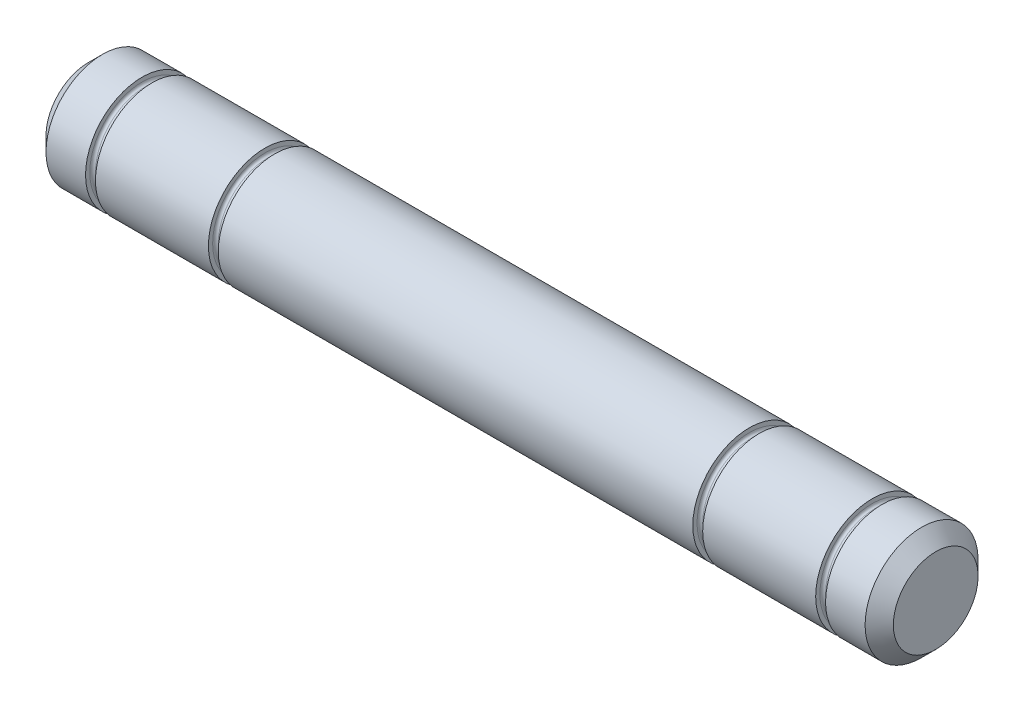
ISO-10303-21;
HEADER;
FILE_DESCRIPTION(('STEP AP214'),'2;1');
FILE_NAME('part.step','',(''),(''),'','','');
FILE_SCHEMA(('AUTOMOTIVE_DESIGN { 1 0 10303 214 1 1 1 1 }'));
ENDSEC;
DATA;
#1=APPLICATION_CONTEXT('core data for automotive mechanical design processes');
#2=APPLICATION_PROTOCOL_DEFINITION('international standard','automotive_design',2000,#1);
#3=PRODUCT_CONTEXT('',#1,'mechanical');
#4=PRODUCT('Part','Part','',(#3));
#5=PRODUCT_RELATED_PRODUCT_CATEGORY('part','',(#4));
#6=PRODUCT_DEFINITION_FORMATION('','',#4);
#7=PRODUCT_DEFINITION_CONTEXT('part definition',#1,'design');
#8=PRODUCT_DEFINITION('design','',#6,#7);
#9=PRODUCT_DEFINITION_SHAPE('','',#8);
#10=(LENGTH_UNIT() NAMED_UNIT(*) SI_UNIT(.MILLI.,.METRE.));
#11=(NAMED_UNIT(*) PLANE_ANGLE_UNIT() SI_UNIT($,.RADIAN.));
#12=(NAMED_UNIT(*) SI_UNIT($,.STERADIAN.) SOLID_ANGLE_UNIT());
#13=UNCERTAINTY_MEASURE_WITH_UNIT(LENGTH_MEASURE(1.E-05),#10,'distance_accuracy_value','');
#14=(GEOMETRIC_REPRESENTATION_CONTEXT(3) GLOBAL_UNCERTAINTY_ASSIGNED_CONTEXT((#13)) GLOBAL_UNIT_ASSIGNED_CONTEXT((#10,
#11,#12)) REPRESENTATION_CONTEXT('',''));
#15=CARTESIAN_POINT('',(0.,0.,0.));
#16=DIRECTION('',(0.,0.,1.));
#17=DIRECTION('',(1.,0.,0.));
#18=AXIS2_PLACEMENT_3D('',#15,#16,#17);
#19=CARTESIAN_POINT('',(-30.,0.,0.));
#20=DIRECTION('',(-1.,0.,0.));
#21=DIRECTION('',(0.,0.,1.));
#22=AXIS2_PLACEMENT_3D('',#19,#20,#21);
#23=CYLINDRICAL_SURFACE('',#22,4.);
#24=CARTESIAN_POINT('',(26.2,0.,0.));
#25=DIRECTION('',(1.,0.,0.));
#26=DIRECTION('',(0.,0.,-1.));
#27=AXIS2_PLACEMENT_3D('',#24,#25,#26);
#28=CIRCLE('',#27,4.);
#29=CARTESIAN_POINT('',(26.2,0.,-4.));
#30=VERTEX_POINT('',#29);
#31=EDGE_CURVE('E63',#30,#30,#28,.T.);
#32=ORIENTED_EDGE('',*,*,#31,.T.);
#33=EDGE_LOOP('',(#32));
#34=FACE_BOUND('',#33,.T.);
#35=CARTESIAN_POINT('',(29.,0.,0.));
#36=DIRECTION('',(-1.,0.,0.));
#37=DIRECTION('',(0.,0.,1.));
#38=AXIS2_PLACEMENT_3D('',#35,#36,#37);
#39=CIRCLE('',#38,4.);
#40=CARTESIAN_POINT('',(29.,0.,4.));
#41=VERTEX_POINT('',#40);
#42=EDGE_CURVE('E49',#41,#41,#39,.T.);
#43=ORIENTED_EDGE('',*,*,#42,.T.);
#44=EDGE_LOOP('',(#43));
#45=FACE_BOUND('',#44,.T.);
#46=ADVANCED_FACE('F35',(#34,#45),#23,.T.);
#47=CARTESIAN_POINT('',(30.,4.,0.));
#48=DIRECTION('',(-1.,0.,0.));
#49=DIRECTION('',(0.,0.,1.));
#50=AXIS2_PLACEMENT_3D('',#47,#48,#49);
#51=PLANE('',#50);
#52=CARTESIAN_POINT('',(30.,0.,0.));
#53=DIRECTION('',(-1.,0.,0.));
#54=DIRECTION('',(0.,0.,1.));
#55=AXIS2_PLACEMENT_3D('',#52,#53,#54);
#56=CIRCLE('',#55,3.);
#57=CARTESIAN_POINT('',(30.,0.,3.));
#58=VERTEX_POINT('',#57);
#59=EDGE_CURVE('E44',#58,#58,#56,.F.);
#60=ORIENTED_EDGE('',*,*,#59,.T.);
#61=EDGE_LOOP('',(#60));
#62=FACE_BOUND('',#61,.T.);
#63=ADVANCED_FACE('F106',(#62),#51,.F.);
#64=CARTESIAN_POINT('',(29.,0.,0.));
#65=DIRECTION('',(-1.,0.,0.));
#66=DIRECTION('',(0.,0.,1.));
#67=AXIS2_PLACEMENT_3D('',#64,#65,#66);
#68=CONICAL_SURFACE('',#67,4.,0.78539816339745);
#69=ORIENTED_EDGE('',*,*,#59,.F.);
#70=EDGE_LOOP('',(#69));
#71=FACE_BOUND('',#70,.T.);
#72=ORIENTED_EDGE('',*,*,#42,.F.);
#73=EDGE_LOOP('',(#72));
#74=FACE_BOUND('',#73,.T.);
#75=ADVANCED_FACE('F103',(#71,#74),#68,.T.);
#76=CARTESIAN_POINT('',(26.2,0.,3.7));
#77=DIRECTION('',(1.,0.,0.));
#78=DIRECTION('',(0.,0.,-1.));
#79=AXIS2_PLACEMENT_3D('',#76,#77,#78);
#80=PLANE('',#79);
#81=CARTESIAN_POINT('',(26.2,0.,0.));
#82=DIRECTION('',(-1.,0.,0.));
#83=DIRECTION('',(0.,0.,1.));
#84=AXIS2_PLACEMENT_3D('',#81,#82,#83);
#85=CIRCLE('',#84,3.7);
#86=CARTESIAN_POINT('',(26.2,0.,3.7));
#87=VERTEX_POINT('',#86);
#88=EDGE_CURVE('E57',#87,#87,#85,.T.);
#89=ORIENTED_EDGE('',*,*,#88,.F.);
#90=EDGE_LOOP('',(#89));
#91=FACE_BOUND('',#90,.T.);
#92=ORIENTED_EDGE('',*,*,#31,.F.);
#93=EDGE_LOOP('',(#92));
#94=FACE_BOUND('',#93,.T.);
#95=ADVANCED_FACE('F105',(#91,#94),#80,.F.);
#96=CARTESIAN_POINT('',(25.5,0.,3.7));
#97=DIRECTION('',(-1.,0.,0.));
#98=DIRECTION('',(0.,0.,1.));
#99=AXIS2_PLACEMENT_3D('',#96,#97,#98);
#100=PLANE('',#99);
#101=CARTESIAN_POINT('',(25.5,0.,0.));
#102=DIRECTION('',(-1.,0.,0.));
#103=DIRECTION('',(0.,0.,1.));
#104=AXIS2_PLACEMENT_3D('',#101,#102,#103);
#105=CIRCLE('',#104,3.7);
#106=CARTESIAN_POINT('',(25.5,0.,3.7));
#107=VERTEX_POINT('',#106);
#108=EDGE_CURVE('E97',#107,#107,#105,.T.);
#109=ORIENTED_EDGE('',*,*,#108,.T.);
#110=EDGE_LOOP('',(#109));
#111=FACE_BOUND('',#110,.T.);
#112=CARTESIAN_POINT('',(25.5,0.,0.));
#113=DIRECTION('',(-1.,0.,0.));
#114=DIRECTION('',(0.,0.,1.));
#115=AXIS2_PLACEMENT_3D('',#112,#113,#114);
#116=CIRCLE('',#115,4.);
#117=CARTESIAN_POINT('',(25.5,0.,4.));
#118=VERTEX_POINT('',#117);
#119=EDGE_CURVE('E60',#118,#118,#116,.T.);
#120=ORIENTED_EDGE('',*,*,#119,.F.);
#121=EDGE_LOOP('',(#120));
#122=FACE_BOUND('',#121,.T.);
#123=ADVANCED_FACE('F112',(#111,#122),#100,.F.);
#124=CARTESIAN_POINT('',(26.,0.,0.));
#125=DIRECTION('',(-1.,0.,0.));
#126=DIRECTION('',(0.,0.,1.));
#127=AXIS2_PLACEMENT_3D('',#124,#125,#126);
#128=TOROIDAL_SURFACE('',#127,3.7,0.199999999999999);
#129=CARTESIAN_POINT('',(26.,0.,0.));
#130=DIRECTION('',(-1.,0.,0.));
#131=DIRECTION('',(0.,0.,1.));
#132=AXIS2_PLACEMENT_3D('',#129,#130,#131);
#133=CIRCLE('',#132,3.5);
#134=CARTESIAN_POINT('',(26.,0.,3.5));
#135=VERTEX_POINT('',#134);
#136=EDGE_CURVE('E396',#135,#135,#133,.T.);
#137=ORIENTED_EDGE('',*,*,#136,.F.);
#138=EDGE_LOOP('',(#137));
#139=FACE_BOUND('',#138,.T.);
#140=ORIENTED_EDGE('',*,*,#88,.T.);
#141=EDGE_LOOP('',(#140));
#142=FACE_BOUND('',#141,.T.);
#143=ADVANCED_FACE('F337',(#139,#142),#128,.F.);
#144=CARTESIAN_POINT('',(0.,0.,0.));
#145=DIRECTION('',(-1.,0.,0.));
#146=DIRECTION('',(0.,0.,1.));
#147=AXIS2_PLACEMENT_3D('',#144,#145,#146);
#148=CYLINDRICAL_SURFACE('',#147,3.5);
#149=CARTESIAN_POINT('',(25.7,0.,0.));
#150=DIRECTION('',(-1.,0.,0.));
#151=DIRECTION('',(0.,0.,1.));
#152=AXIS2_PLACEMENT_3D('',#149,#150,#151);
#153=CIRCLE('',#152,3.5);
#154=CARTESIAN_POINT('',(25.7,0.,3.5));
#155=VERTEX_POINT('',#154);
#156=EDGE_CURVE('E395',#155,#155,#153,.T.);
#157=ORIENTED_EDGE('',*,*,#156,.F.);
#158=EDGE_LOOP('',(#157));
#159=FACE_BOUND('',#158,.T.);
#160=ORIENTED_EDGE('',*,*,#136,.T.);
#161=EDGE_LOOP('',(#160));
#162=FACE_BOUND('',#161,.T.);
#163=ADVANCED_FACE('F347',(#159,#162),#148,.T.);
#164=CARTESIAN_POINT('',(25.7,0.,0.));
#165=DIRECTION('',(-1.,0.,0.));
#166=DIRECTION('',(0.,0.,1.));
#167=AXIS2_PLACEMENT_3D('',#164,#165,#166);
#168=TOROIDAL_SURFACE('',#167,3.7,0.199999999999999);
#169=ORIENTED_EDGE('',*,*,#108,.F.);
#170=EDGE_LOOP('',(#169));
#171=FACE_BOUND('',#170,.T.);
#172=ORIENTED_EDGE('',*,*,#156,.T.);
#173=EDGE_LOOP('',(#172));
#174=FACE_BOUND('',#173,.T.);
#175=ADVANCED_FACE('F131',(#171,#174),#168,.F.);
#176=ORIENTED_EDGE('',*,*,#119,.T.);
#177=EDGE_LOOP('',(#176));
#178=FACE_BOUND('',#177,.T.);
#179=CARTESIAN_POINT('',(17.5,0.,0.));
#180=DIRECTION('',(1.,0.,0.));
#181=DIRECTION('',(0.,0.,-1.));
#182=AXIS2_PLACEMENT_3D('',#179,#180,#181);
#183=CIRCLE('',#182,4.);
#184=CARTESIAN_POINT('',(17.5,0.,-4.));
#185=VERTEX_POINT('',#184);
#186=EDGE_CURVE('E56',#185,#185,#183,.T.);
#187=ORIENTED_EDGE('',*,*,#186,.T.);
#188=EDGE_LOOP('',(#187));
#189=FACE_BOUND('',#188,.T.);
#190=ADVANCED_FACE('F123',(#178,#189),#23,.T.);
#191=CARTESIAN_POINT('',(17.5,0.,3.7));
#192=DIRECTION('',(1.,0.,0.));
#193=DIRECTION('',(0.,0.,-1.));
#194=AXIS2_PLACEMENT_3D('',#191,#192,#193);
#195=PLANE('',#194);
#196=CARTESIAN_POINT('',(17.5,0.,0.));
#197=DIRECTION('',(-1.,0.,0.));
#198=DIRECTION('',(0.,0.,1.));
#199=AXIS2_PLACEMENT_3D('',#196,#197,#198);
#200=CIRCLE('',#199,3.7);
#201=CARTESIAN_POINT('',(17.5,0.,3.7));
#202=VERTEX_POINT('',#201);
#203=EDGE_CURVE('E94',#202,#202,#200,.T.);
#204=ORIENTED_EDGE('',*,*,#203,.F.);
#205=EDGE_LOOP('',(#204));
#206=FACE_BOUND('',#205,.T.);
#207=ORIENTED_EDGE('',*,*,#186,.F.);
#208=EDGE_LOOP('',(#207));
#209=FACE_BOUND('',#208,.T.);
#210=ADVANCED_FACE('F130',(#206,#209),#195,.F.);
#211=CARTESIAN_POINT('',(16.8,0.,3.7));
#212=DIRECTION('',(-1.,0.,0.));
#213=DIRECTION('',(0.,0.,1.));
#214=AXIS2_PLACEMENT_3D('',#211,#212,#213);
#215=PLANE('',#214);
#216=CARTESIAN_POINT('',(16.8,0.,0.));
#217=DIRECTION('',(-1.,0.,0.));
#218=DIRECTION('',(0.,0.,1.));
#219=AXIS2_PLACEMENT_3D('',#216,#217,#218);
#220=CIRCLE('',#219,3.7);
#221=CARTESIAN_POINT('',(16.8,0.,3.7));
#222=VERTEX_POINT('',#221);
#223=EDGE_CURVE('E78',#222,#222,#220,.T.);
#224=ORIENTED_EDGE('',*,*,#223,.T.);
#225=EDGE_LOOP('',(#224));
#226=FACE_BOUND('',#225,.T.);
#227=CARTESIAN_POINT('',(16.8,0.,0.));
#228=DIRECTION('',(-1.,0.,0.));
#229=DIRECTION('',(0.,0.,1.));
#230=AXIS2_PLACEMENT_3D('',#227,#228,#229);
#231=CIRCLE('',#230,4.);
#232=CARTESIAN_POINT('',(16.8,0.,4.));
#233=VERTEX_POINT('',#232);
#234=EDGE_CURVE('E53',#233,#233,#231,.T.);
#235=ORIENTED_EDGE('',*,*,#234,.F.);
#236=EDGE_LOOP('',(#235));
#237=FACE_BOUND('',#236,.T.);
#238=ADVANCED_FACE('F173',(#226,#237),#215,.F.);
#239=CARTESIAN_POINT('',(17.3,0.,0.));
#240=DIRECTION('',(-1.,0.,0.));
#241=DIRECTION('',(0.,0.,1.));
#242=AXIS2_PLACEMENT_3D('',#239,#240,#241);
#243=TOROIDAL_SURFACE('',#242,3.7,0.200000000000001);
#244=CARTESIAN_POINT('',(17.3,0.,0.));
#245=DIRECTION('',(-1.,0.,0.));
#246=DIRECTION('',(0.,0.,1.));
#247=AXIS2_PLACEMENT_3D('',#244,#245,#246);
#248=CIRCLE('',#247,3.5);
#249=CARTESIAN_POINT('',(17.3,0.,3.5));
#250=VERTEX_POINT('',#249);
#251=EDGE_CURVE('E87',#250,#250,#248,.T.);
#252=ORIENTED_EDGE('',*,*,#251,.F.);
#253=EDGE_LOOP('',(#252));
#254=FACE_BOUND('',#253,.T.);
#255=ORIENTED_EDGE('',*,*,#203,.T.);
#256=EDGE_LOOP('',(#255));
#257=FACE_BOUND('',#256,.T.);
#258=ADVANCED_FACE('F175',(#254,#257),#243,.F.);
#259=CARTESIAN_POINT('',(0.,0.,0.));
#260=DIRECTION('',(-1.,0.,0.));
#261=DIRECTION('',(0.,0.,1.));
#262=AXIS2_PLACEMENT_3D('',#259,#260,#261);
#263=CYLINDRICAL_SURFACE('',#262,3.5);
#264=CARTESIAN_POINT('',(17.,0.,0.));
#265=DIRECTION('',(-1.,0.,0.));
#266=DIRECTION('',(0.,0.,1.));
#267=AXIS2_PLACEMENT_3D('',#264,#265,#266);
#268=CIRCLE('',#267,3.5);
#269=CARTESIAN_POINT('',(17.,0.,3.5));
#270=VERTEX_POINT('',#269);
#271=EDGE_CURVE('E82',#270,#270,#268,.T.);
#272=ORIENTED_EDGE('',*,*,#271,.F.);
#273=EDGE_LOOP('',(#272));
#274=FACE_BOUND('',#273,.T.);
#275=ORIENTED_EDGE('',*,*,#251,.T.);
#276=EDGE_LOOP('',(#275));
#277=FACE_BOUND('',#276,.T.);
#278=ADVANCED_FACE('F166',(#274,#277),#263,.T.);
#279=CARTESIAN_POINT('',(17.,0.,0.));
#280=DIRECTION('',(-1.,0.,0.));
#281=DIRECTION('',(0.,0.,1.));
#282=AXIS2_PLACEMENT_3D('',#279,#280,#281);
#283=TOROIDAL_SURFACE('',#282,3.7,0.199999999999999);
#284=ORIENTED_EDGE('',*,*,#223,.F.);
#285=EDGE_LOOP('',(#284));
#286=FACE_BOUND('',#285,.T.);
#287=ORIENTED_EDGE('',*,*,#271,.T.);
#288=EDGE_LOOP('',(#287));
#289=FACE_BOUND('',#288,.T.);
#290=ADVANCED_FACE('F157',(#286,#289),#283,.F.);
#291=CARTESIAN_POINT('',(-16.8,0.,0.));
#292=DIRECTION('',(1.,0.,0.));
#293=DIRECTION('',(0.,0.,-1.));
#294=AXIS2_PLACEMENT_3D('',#291,#292,#293);
#295=CIRCLE('',#294,4.);
#296=CARTESIAN_POINT('',(-16.8,0.,-4.));
#297=VERTEX_POINT('',#296);
#298=EDGE_CURVE('E67',#297,#297,#295,.T.);
#299=ORIENTED_EDGE('',*,*,#298,.T.);
#300=EDGE_LOOP('',(#299));
#301=FACE_BOUND('',#300,.T.);
#302=ORIENTED_EDGE('',*,*,#234,.T.);
#303=EDGE_LOOP('',(#302));
#304=FACE_BOUND('',#303,.T.);
#305=ADVANCED_FACE('F127',(#301,#304),#23,.T.);
#306=CARTESIAN_POINT('',(-17.5,0.,3.7));
#307=DIRECTION('',(-1.,0.,0.));
#308=DIRECTION('',(0.,0.,-1.));
#309=AXIS2_PLACEMENT_3D('',#306,#307,#308);
#310=PLANE('',#309);
#311=CARTESIAN_POINT('',(-17.5,0.,0.));
#312=DIRECTION('',(-1.,0.,0.));
#313=DIRECTION('',(0.,0.,1.));
#314=AXIS2_PLACEMENT_3D('',#311,#312,#313);
#315=CIRCLE('',#314,3.7);
#316=CARTESIAN_POINT('',(-17.5,0.,3.7));
#317=VERTEX_POINT('',#316);
#318=EDGE_CURVE('E401',#317,#317,#315,.T.);
#319=ORIENTED_EDGE('',*,*,#318,.T.);
#320=EDGE_LOOP('',(#319));
#321=FACE_BOUND('',#320,.T.);
#322=CARTESIAN_POINT('',(-17.5,0.,0.));
#323=DIRECTION('',(-1.,0.,0.));
#324=DIRECTION('',(0.,0.,1.));
#325=AXIS2_PLACEMENT_3D('',#322,#323,#324);
#326=CIRCLE('',#325,4.);
#327=CARTESIAN_POINT('',(-17.5,0.,4.));
#328=VERTEX_POINT('',#327);
#329=EDGE_CURVE('E70',#328,#328,#326,.T.);
#330=ORIENTED_EDGE('',*,*,#329,.F.);
#331=EDGE_LOOP('',(#330));
#332=FACE_BOUND('',#331,.T.);
#333=ADVANCED_FACE('F156',(#321,#332),#310,.F.);
#334=CARTESIAN_POINT('',(-16.8,0.,3.7));
#335=DIRECTION('',(1.,0.,0.));
#336=DIRECTION('',(0.,0.,1.));
#337=AXIS2_PLACEMENT_3D('',#334,#335,#336);
#338=PLANE('',#337);
#339=CARTESIAN_POINT('',(-16.8,0.,0.));
#340=DIRECTION('',(-1.,0.,0.));
#341=DIRECTION('',(0.,0.,1.));
#342=AXIS2_PLACEMENT_3D('',#339,#340,#341);
#343=CIRCLE('',#342,3.7);
#344=CARTESIAN_POINT('',(-16.8,0.,3.7));
#345=VERTEX_POINT('',#344);
#346=EDGE_CURVE('E411',#345,#345,#343,.T.);
#347=ORIENTED_EDGE('',*,*,#346,.F.);
#348=EDGE_LOOP('',(#347));
#349=FACE_BOUND('',#348,.T.);
#350=ORIENTED_EDGE('',*,*,#298,.F.);
#351=EDGE_LOOP('',(#350));
#352=FACE_BOUND('',#351,.T.);
#353=ADVANCED_FACE('F163',(#349,#352),#338,.F.);
#354=CARTESIAN_POINT('',(-17.3,0.,0.));
#355=DIRECTION('',(1.,0.,0.));
#356=DIRECTION('',(0.,0.,1.));
#357=AXIS2_PLACEMENT_3D('',#354,#355,#356);
#358=TOROIDAL_SURFACE('',#357,3.7,0.200000000000001);
#359=CARTESIAN_POINT('',(-17.3,0.,0.));
#360=DIRECTION('',(-1.,0.,0.));
#361=DIRECTION('',(0.,0.,1.));
#362=AXIS2_PLACEMENT_3D('',#359,#360,#361);
#363=CIRCLE('',#362,3.5);
#364=CARTESIAN_POINT('',(-17.3,0.,3.5));
#365=VERTEX_POINT('',#364);
#366=EDGE_CURVE('E405',#365,#365,#363,.T.);
#367=ORIENTED_EDGE('',*,*,#366,.T.);
#368=EDGE_LOOP('',(#367));
#369=FACE_BOUND('',#368,.T.);
#370=ORIENTED_EDGE('',*,*,#318,.F.);
#371=EDGE_LOOP('',(#370));
#372=FACE_BOUND('',#371,.T.);
#373=ADVANCED_FACE('F228',(#369,#372),#358,.F.);
#374=CARTESIAN_POINT('',(0.,0.,0.));
#375=DIRECTION('',(1.,0.,0.));
#376=DIRECTION('',(0.,0.,1.));
#377=AXIS2_PLACEMENT_3D('',#374,#375,#376);
#378=CYLINDRICAL_SURFACE('',#377,3.5);
#379=CARTESIAN_POINT('',(-17.,0.,0.));
#380=DIRECTION('',(-1.,0.,0.));
#381=DIRECTION('',(0.,0.,1.));
#382=AXIS2_PLACEMENT_3D('',#379,#380,#381);
#383=CIRCLE('',#382,3.5);
#384=CARTESIAN_POINT('',(-17.,0.,3.5));
#385=VERTEX_POINT('',#384);
#386=EDGE_CURVE('E408',#385,#385,#383,.T.);
#387=ORIENTED_EDGE('',*,*,#386,.T.);
#388=EDGE_LOOP('',(#387));
#389=FACE_BOUND('',#388,.T.);
#390=ORIENTED_EDGE('',*,*,#366,.F.);
#391=EDGE_LOOP('',(#390));
#392=FACE_BOUND('',#391,.T.);
#393=ADVANCED_FACE('F144',(#389,#392),#378,.T.);
#394=CARTESIAN_POINT('',(-17.,0.,0.));
#395=DIRECTION('',(1.,0.,0.));
#396=DIRECTION('',(0.,0.,1.));
#397=AXIS2_PLACEMENT_3D('',#394,#395,#396);
#398=TOROIDAL_SURFACE('',#397,3.7,0.199999999999999);
#399=ORIENTED_EDGE('',*,*,#346,.T.);
#400=EDGE_LOOP('',(#399));
#401=FACE_BOUND('',#400,.T.);
#402=ORIENTED_EDGE('',*,*,#386,.F.);
#403=EDGE_LOOP('',(#402));
#404=FACE_BOUND('',#403,.T.);
#405=ADVANCED_FACE('F135',(#401,#404),#398,.F.);
#406=CARTESIAN_POINT('',(-25.5,0.,0.));
#407=DIRECTION('',(1.,0.,0.));
#408=DIRECTION('',(0.,0.,-1.));
#409=AXIS2_PLACEMENT_3D('',#406,#407,#408);
#410=CIRCLE('',#409,4.);
#411=CARTESIAN_POINT('',(-25.5,0.,-4.));
#412=VERTEX_POINT('',#411);
#413=EDGE_CURVE('E73',#412,#412,#410,.T.);
#414=ORIENTED_EDGE('',*,*,#413,.T.);
#415=EDGE_LOOP('',(#414));
#416=FACE_BOUND('',#415,.T.);
#417=ORIENTED_EDGE('',*,*,#329,.T.);
#418=EDGE_LOOP('',(#417));
#419=FACE_BOUND('',#418,.T.);
#420=ADVANCED_FACE('F124',(#416,#419),#23,.T.);
#421=CARTESIAN_POINT('',(-26.2,0.,3.7));
#422=DIRECTION('',(-1.,0.,0.));
#423=DIRECTION('',(0.,0.,-1.));
#424=AXIS2_PLACEMENT_3D('',#421,#422,#423);
#425=PLANE('',#424);
#426=CARTESIAN_POINT('',(-26.2,0.,0.));
#427=DIRECTION('',(-1.,0.,0.));
#428=DIRECTION('',(0.,0.,1.));
#429=AXIS2_PLACEMENT_3D('',#426,#427,#428);
#430=CIRCLE('',#429,3.7);
#431=CARTESIAN_POINT('',(-26.2,0.,3.7));
#432=VERTEX_POINT('',#431);
#433=EDGE_CURVE('E71',#432,#432,#430,.T.);
#434=ORIENTED_EDGE('',*,*,#433,.T.);
#435=EDGE_LOOP('',(#434));
#436=FACE_BOUND('',#435,.T.);
#437=CARTESIAN_POINT('',(-26.2,0.,0.));
#438=DIRECTION('',(-1.,0.,0.));
#439=DIRECTION('',(0.,0.,1.));
#440=AXIS2_PLACEMENT_3D('',#437,#438,#439);
#441=CIRCLE('',#440,4.);
#442=CARTESIAN_POINT('',(-26.2,0.,4.));
#443=VERTEX_POINT('',#442);
#444=EDGE_CURVE('E40',#443,#443,#441,.T.);
#445=ORIENTED_EDGE('',*,*,#444,.F.);
#446=EDGE_LOOP('',(#445));
#447=FACE_BOUND('',#446,.T.);
#448=ADVANCED_FACE('F134',(#436,#447),#425,.F.);
#449=CARTESIAN_POINT('',(-25.5,0.,3.7));
#450=DIRECTION('',(1.,0.,0.));
#451=DIRECTION('',(0.,0.,1.));
#452=AXIS2_PLACEMENT_3D('',#449,#450,#451);
#453=PLANE('',#452);
#454=CARTESIAN_POINT('',(-25.5,0.,0.));
#455=DIRECTION('',(-1.,0.,0.));
#456=DIRECTION('',(0.,0.,1.));
#457=AXIS2_PLACEMENT_3D('',#454,#455,#456);
#458=CIRCLE('',#457,3.7);
#459=CARTESIAN_POINT('',(-25.5,0.,3.7));
#460=VERTEX_POINT('',#459);
#461=EDGE_CURVE('E404',#460,#460,#458,.T.);
#462=ORIENTED_EDGE('',*,*,#461,.F.);
#463=EDGE_LOOP('',(#462));
#464=FACE_BOUND('',#463,.T.);
#465=ORIENTED_EDGE('',*,*,#413,.F.);
#466=EDGE_LOOP('',(#465));
#467=FACE_BOUND('',#466,.T.);
#468=ADVANCED_FACE('F141',(#464,#467),#453,.F.);
#469=CARTESIAN_POINT('',(-26.,0.,0.));
#470=DIRECTION('',(1.,0.,0.));
#471=DIRECTION('',(0.,0.,1.));
#472=AXIS2_PLACEMENT_3D('',#469,#470,#471);
#473=TOROIDAL_SURFACE('',#472,3.7,0.199999999999999);
#474=CARTESIAN_POINT('',(-26.,0.,0.));
#475=DIRECTION('',(-1.,0.,0.));
#476=DIRECTION('',(0.,0.,1.));
#477=AXIS2_PLACEMENT_3D('',#474,#475,#476);
#478=CIRCLE('',#477,3.5);
#479=CARTESIAN_POINT('',(-26.,0.,3.5));
#480=VERTEX_POINT('',#479);
#481=EDGE_CURVE('E416',#480,#480,#478,.T.);
#482=ORIENTED_EDGE('',*,*,#481,.T.);
#483=EDGE_LOOP('',(#482));
#484=FACE_BOUND('',#483,.T.);
#485=ORIENTED_EDGE('',*,*,#433,.F.);
#486=EDGE_LOOP('',(#485));
#487=FACE_BOUND('',#486,.T.);
#488=ADVANCED_FACE('F271',(#484,#487),#473,.F.);
#489=CARTESIAN_POINT('',(0.,0.,0.));
#490=DIRECTION('',(1.,0.,0.));
#491=DIRECTION('',(0.,0.,1.));
#492=AXIS2_PLACEMENT_3D('',#489,#490,#491);
#493=CYLINDRICAL_SURFACE('',#492,3.5);
#494=CARTESIAN_POINT('',(-25.7,0.,0.));
#495=DIRECTION('',(-1.,0.,0.));
#496=DIRECTION('',(0.,0.,1.));
#497=AXIS2_PLACEMENT_3D('',#494,#495,#496);
#498=CIRCLE('',#497,3.5);
#499=CARTESIAN_POINT('',(-25.7,0.,3.5));
#500=VERTEX_POINT('',#499);
#501=EDGE_CURVE('E419',#500,#500,#498,.T.);
#502=ORIENTED_EDGE('',*,*,#501,.T.);
#503=EDGE_LOOP('',(#502));
#504=FACE_BOUND('',#503,.T.);
#505=ORIENTED_EDGE('',*,*,#481,.F.);
#506=EDGE_LOOP('',(#505));
#507=FACE_BOUND('',#506,.T.);
#508=ADVANCED_FACE('F281',(#504,#507),#493,.T.);
#509=CARTESIAN_POINT('',(-25.7,0.,0.));
#510=DIRECTION('',(1.,0.,0.));
#511=DIRECTION('',(0.,0.,1.));
#512=AXIS2_PLACEMENT_3D('',#509,#510,#511);
#513=TOROIDAL_SURFACE('',#512,3.7,0.199999999999999);
#514=ORIENTED_EDGE('',*,*,#461,.T.);
#515=EDGE_LOOP('',(#514));
#516=FACE_BOUND('',#515,.T.);
#517=ORIENTED_EDGE('',*,*,#501,.F.);
#518=EDGE_LOOP('',(#517));
#519=FACE_BOUND('',#518,.T.);
#520=ADVANCED_FACE('F291',(#516,#519),#513,.F.);
#521=CARTESIAN_POINT('',(-30.,4.,0.));
#522=DIRECTION('',(1.,0.,0.));
#523=DIRECTION('',(0.,0.,-1.));
#524=AXIS2_PLACEMENT_3D('',#521,#522,#523);
#525=PLANE('',#524);
#526=CARTESIAN_POINT('',(-30.,0.,0.));
#527=DIRECTION('',(1.,0.,0.));
#528=DIRECTION('',(0.,0.,-1.));
#529=AXIS2_PLACEMENT_3D('',#526,#527,#528);
#530=CIRCLE('',#529,3.);
#531=CARTESIAN_POINT('',(-30.,0.,-3.));
#532=VERTEX_POINT('',#531);
#533=EDGE_CURVE('E10',#532,#532,#530,.F.);
#534=ORIENTED_EDGE('',*,*,#533,.T.);
#535=EDGE_LOOP('',(#534));
#536=FACE_BOUND('',#535,.T.);
#537=ADVANCED_FACE('F152',(#536),#525,.F.);
#538=CARTESIAN_POINT('',(-30.,0.,0.));
#539=DIRECTION('',(1.,0.,0.));
#540=DIRECTION('',(0.,0.,-1.));
#541=AXIS2_PLACEMENT_3D('',#538,#539,#540);
#542=CONICAL_SURFACE('',#541,3.,0.785398163397448);
#543=CARTESIAN_POINT('',(-29.,0.,0.));
#544=DIRECTION('',(1.,0.,0.));
#545=DIRECTION('',(0.,0.,-1.));
#546=AXIS2_PLACEMENT_3D('',#543,#544,#545);
#547=CIRCLE('',#546,4.);
#548=CARTESIAN_POINT('',(-29.,0.,-4.));
#549=VERTEX_POINT('',#548);
#550=EDGE_CURVE('E66',#549,#549,#547,.T.);
#551=ORIENTED_EDGE('',*,*,#550,.F.);
#552=EDGE_LOOP('',(#551));
#553=FACE_BOUND('',#552,.T.);
#554=ORIENTED_EDGE('',*,*,#533,.F.);
#555=EDGE_LOOP('',(#554));
#556=FACE_BOUND('',#555,.T.);
#557=ADVANCED_FACE('F38',(#553,#556),#542,.T.);
#558=ORIENTED_EDGE('',*,*,#444,.T.);
#559=EDGE_LOOP('',(#558));
#560=FACE_BOUND('',#559,.T.);
#561=ORIENTED_EDGE('',*,*,#550,.T.);
#562=EDGE_LOOP('',(#561));
#563=FACE_BOUND('',#562,.T.);
#564=ADVANCED_FACE('F136',(#560,#563),#23,.T.);
#565=CLOSED_SHELL('',(#46,#63,#75,#95,#123,#143,#163,#175,#190,#210,#238,#258,#278,#290,#305,
#333,#353,#373,#393,#405,#420,#448,#468,#488,#508,#520,#537,#557,#564));
#566=MANIFOLD_SOLID_BREP('B2',#565);
#567=ADVANCED_BREP_SHAPE_REPRESENTATION('',(#18,#566),#14);
#568=SHAPE_DEFINITION_REPRESENTATION(#9,#567);
ENDSEC;
END-ISO-10303-21;
